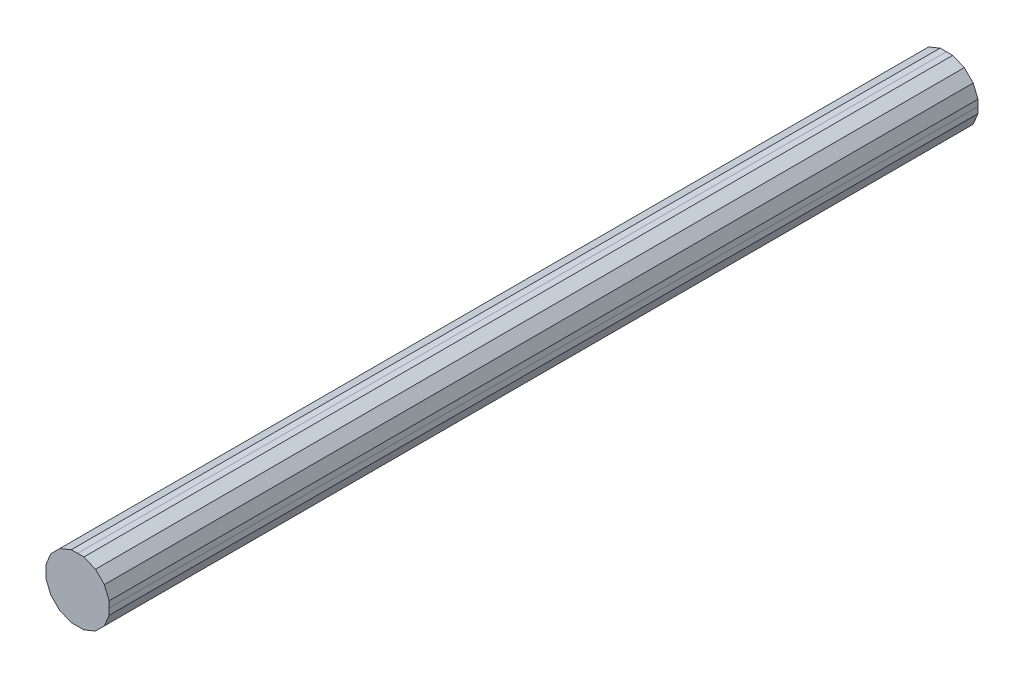
ISO-10303-21;
HEADER;
FILE_DESCRIPTION(('STEP AP214'),'2;1');
FILE_NAME('part.step','',(''),(''),'','','');
FILE_SCHEMA(('AUTOMOTIVE_DESIGN { 1 0 10303 214 1 1 1 1 }'));
ENDSEC;
DATA;
#1=APPLICATION_CONTEXT('core data for automotive mechanical design processes');
#2=APPLICATION_PROTOCOL_DEFINITION('international standard','automotive_design',2000,#1);
#3=PRODUCT_CONTEXT('',#1,'mechanical');
#4=PRODUCT('Part','Part','',(#3));
#5=PRODUCT_RELATED_PRODUCT_CATEGORY('part','',(#4));
#6=PRODUCT_DEFINITION_FORMATION('','',#4);
#7=PRODUCT_DEFINITION_CONTEXT('part definition',#1,'design');
#8=PRODUCT_DEFINITION('design','',#6,#7);
#9=PRODUCT_DEFINITION_SHAPE('','',#8);
#10=(LENGTH_UNIT() NAMED_UNIT(*) SI_UNIT(.MILLI.,.METRE.));
#11=(NAMED_UNIT(*) PLANE_ANGLE_UNIT() SI_UNIT($,.RADIAN.));
#12=(NAMED_UNIT(*) SI_UNIT($,.STERADIAN.) SOLID_ANGLE_UNIT());
#13=UNCERTAINTY_MEASURE_WITH_UNIT(LENGTH_MEASURE(1.E-05),#10,'distance_accuracy_value','');
#14=(GEOMETRIC_REPRESENTATION_CONTEXT(3) GLOBAL_UNCERTAINTY_ASSIGNED_CONTEXT((#13)) GLOBAL_UNIT_ASSIGNED_CONTEXT((#10,
#11,#12)) REPRESENTATION_CONTEXT('',''));
#15=CARTESIAN_POINT('',(0.,0.,0.));
#16=DIRECTION('',(0.,0.,1.));
#17=DIRECTION('',(1.,0.,0.));
#18=AXIS2_PLACEMENT_3D('',#15,#16,#17);
#19=CARTESIAN_POINT('',(-0.25449276,0.,7.00000124));
#20=DIRECTION('',(0.,0.,-1.));
#21=DIRECTION('',(0.,-1.,0.));
#22=AXIS2_PLACEMENT_3D('',#19,#20,#21);
#23=PLANE('',#22);
#24=DIRECTION('',(0.,-1.,0.));
#25=VECTOR('',#24,1.);
#26=CARTESIAN_POINT('',(-0.25449276,0.,7.00000124));
#27=LINE('',#26,#25);
#28=CARTESIAN_POINT('',(-0.25449276,0.,7.00000124));
#29=VERTEX_POINT('',#28);
#30=CARTESIAN_POINT('',(-0.25449276,-0.05061966,7.00000124));
#31=VERTEX_POINT('',#30);
#32=EDGE_CURVE('E290',#29,#31,#27,.T.);
#33=ORIENTED_EDGE('',*,*,#32,.T.);
#34=DIRECTION('',(0.382687101635991,-0.923878012640979,0.));
#35=VECTOR('',#34,1.);
#36=CARTESIAN_POINT('',(-0.25449276,-0.05061966,7.00000124));
#37=LINE('',#36,#35);
#38=CARTESIAN_POINT('',(-0.2157476,-0.1441577,7.00000124));
#39=VERTEX_POINT('',#38);
#40=EDGE_CURVE('E206',#31,#39,#37,.T.);
#41=ORIENTED_EDGE('',*,*,#40,.T.);
#42=DIRECTION('',(0.707106781186048,-0.707106781187048,0.));
#43=VECTOR('',#42,1.);
#44=CARTESIAN_POINT('',(-0.2157476,-0.1441577,7.00000124));
#45=LINE('',#44,#43);
#46=CARTESIAN_POINT('',(-0.1441577,-0.2157476,7.00000124));
#47=VERTEX_POINT('',#46);
#48=EDGE_CURVE('E204',#39,#47,#45,.T.);
#49=ORIENTED_EDGE('',*,*,#48,.T.);
#50=DIRECTION('',(0.923878012641332,-0.382687101635137,0.));
#51=VECTOR('',#50,1.);
#52=CARTESIAN_POINT('',(-0.1441577,-0.2157476,7.00000124));
#53=LINE('',#52,#51);
#54=CARTESIAN_POINT('',(-0.05061966,-0.25449276,7.00000124));
#55=VERTEX_POINT('',#54);
#56=EDGE_CURVE('E189',#47,#55,#53,.T.);
#57=ORIENTED_EDGE('',*,*,#56,.T.);
#58=DIRECTION('',(1.,0.,0.));
#59=VECTOR('',#58,1.);
#60=CARTESIAN_POINT('',(-0.05061966,-0.25449276,7.00000124));
#61=LINE('',#60,#59);
#62=CARTESIAN_POINT('',(0.,-0.25449276,7.00000124));
#63=VERTEX_POINT('',#62);
#64=EDGE_CURVE('E320',#55,#63,#61,.T.);
#65=ORIENTED_EDGE('',*,*,#64,.T.);
#66=DIRECTION('',(1.,0.,0.));
#67=VECTOR('',#66,1.);
#68=CARTESIAN_POINT('',(0.,-0.25449276,7.00000124));
#69=LINE('',#68,#67);
#70=CARTESIAN_POINT('',(0.05062220000002,-0.25449276,7.00000124));
#71=VERTEX_POINT('',#70);
#72=EDGE_CURVE('E306',#63,#71,#69,.T.);
#73=ORIENTED_EDGE('',*,*,#72,.T.);
#74=DIRECTION('',(0.923878012640979,0.382687101635991,0.));
#75=VECTOR('',#74,1.);
#76=CARTESIAN_POINT('',(0.05062220000002,-0.25449276,7.00000124));
#77=LINE('',#76,#75);
#78=CARTESIAN_POINT('',(0.14416024,-0.2157476,7.00000124));
#79=VERTEX_POINT('',#78);
#80=EDGE_CURVE('E228',#71,#79,#77,.T.);
#81=ORIENTED_EDGE('',*,*,#80,.T.);
#82=DIRECTION('',(0.707106781187048,0.707106781186048,0.));
#83=VECTOR('',#82,1.);
#84=CARTESIAN_POINT('',(0.14416024,-0.2157476,7.00000124));
#85=LINE('',#84,#83);
#86=CARTESIAN_POINT('',(0.21575014,-0.1441577,7.00000124));
#87=VERTEX_POINT('',#86);
#88=EDGE_CURVE('E358',#79,#87,#85,.T.);
#89=ORIENTED_EDGE('',*,*,#88,.T.);
#90=DIRECTION('',(0.382665687744127,0.923886882374306,0.));
#91=VECTOR('',#90,1.);
#92=CARTESIAN_POINT('',(0.21575014,-0.1441577,7.00000124));
#93=LINE('',#92,#91);
#94=CARTESIAN_POINT('',(0.25449276,-0.05061966,7.00000124));
#95=VERTEX_POINT('',#94);
#96=EDGE_CURVE('E331',#87,#95,#93,.T.);
#97=ORIENTED_EDGE('',*,*,#96,.T.);
#98=DIRECTION('',(0.,1.,0.));
#99=VECTOR('',#98,1.);
#100=CARTESIAN_POINT('',(0.25449276,-0.05061966,7.00000124));
#101=LINE('',#100,#99);
#102=CARTESIAN_POINT('',(0.25449276,-2.539999982787E-06,7.00000124));
#103=VERTEX_POINT('',#102);
#104=EDGE_CURVE('E250',#95,#103,#101,.T.);
#105=ORIENTED_EDGE('',*,*,#104,.T.);
#106=DIRECTION('',(0.,1.,0.));
#107=VECTOR('',#106,1.);
#108=CARTESIAN_POINT('',(0.25449276,-2.539999982787E-06,7.00000124));
#109=LINE('',#108,#107);
#110=CARTESIAN_POINT('',(0.25449276,0.05061966000001,7.00000124));
#111=VERTEX_POINT('',#110);
#112=EDGE_CURVE('E234',#103,#111,#109,.T.);
#113=ORIENTED_EDGE('',*,*,#112,.T.);
#114=DIRECTION('',(-0.382665687744127,0.923886882374306,0.));
#115=VECTOR('',#114,1.);
#116=CARTESIAN_POINT('',(0.25449276,0.05061966000001,7.00000124));
#117=LINE('',#116,#115);
#118=CARTESIAN_POINT('',(0.21575014,0.1441577,7.00000124));
#119=VERTEX_POINT('',#118);
#120=EDGE_CURVE('E271',#111,#119,#117,.T.);
#121=ORIENTED_EDGE('',*,*,#120,.T.);
#122=DIRECTION('',(-0.707106781187048,0.707106781186048,0.));
#123=VECTOR('',#122,1.);
#124=CARTESIAN_POINT('',(0.21575014,0.1441577,7.00000124));
#125=LINE('',#124,#123);
#126=CARTESIAN_POINT('',(0.14416024,0.2157476,7.00000124));
#127=VERTEX_POINT('',#126);
#128=EDGE_CURVE('E687',#119,#127,#125,.T.);
#129=ORIENTED_EDGE('',*,*,#128,.T.);
#130=DIRECTION('',(-0.923878012640979,0.382687101635991,0.));
#131=VECTOR('',#130,1.);
#132=CARTESIAN_POINT('',(0.14416024,0.2157476,7.00000124));
#133=LINE('',#132,#131);
#134=CARTESIAN_POINT('',(0.05062220000002,0.25449276,7.00000124));
#135=VERTEX_POINT('',#134);
#136=EDGE_CURVE('E370',#127,#135,#133,.T.);
#137=ORIENTED_EDGE('',*,*,#136,.T.);
#138=DIRECTION('',(-1.,0.,0.));
#139=VECTOR('',#138,1.);
#140=CARTESIAN_POINT('',(0.05062220000002,0.25449276,7.00000124));
#141=LINE('',#140,#139);
#142=CARTESIAN_POINT('',(0.,0.25449276,7.00000124));
#143=VERTEX_POINT('',#142);
#144=EDGE_CURVE('E291',#135,#143,#141,.T.);
#145=ORIENTED_EDGE('',*,*,#144,.T.);
#146=DIRECTION('',(-1.,0.,0.));
#147=VECTOR('',#146,1.);
#148=CARTESIAN_POINT('',(0.,0.25449276,7.00000124));
#149=LINE('',#148,#147);
#150=CARTESIAN_POINT('',(-0.05061966,0.25449276,7.00000124));
#151=VERTEX_POINT('',#150);
#152=EDGE_CURVE('E310',#143,#151,#149,.T.);
#153=ORIENTED_EDGE('',*,*,#152,.T.);
#154=DIRECTION('',(-0.923878012640979,-0.382687101635991,0.));
#155=VECTOR('',#154,1.);
#156=CARTESIAN_POINT('',(-0.05061966,0.25449276,7.00000124));
#157=LINE('',#156,#155);
#158=CARTESIAN_POINT('',(-0.1441577,0.2157476,7.00000124));
#159=VERTEX_POINT('',#158);
#160=EDGE_CURVE('E315',#151,#159,#157,.T.);
#161=ORIENTED_EDGE('',*,*,#160,.T.);
#162=DIRECTION('',(-0.707106781186548,-0.707106781186548,0.));
#163=VECTOR('',#162,1.);
#164=CARTESIAN_POINT('',(-0.1441577,0.2157476,7.00000124));
#165=LINE('',#164,#163);
#166=CARTESIAN_POINT('',(-0.2157476,0.1441577,7.00000124));
#167=VERTEX_POINT('',#166);
#168=EDGE_CURVE('E259',#159,#167,#165,.T.);
#169=ORIENTED_EDGE('',*,*,#168,.T.);
#170=DIRECTION('',(-0.382687101635991,-0.923878012640979,0.));
#171=VECTOR('',#170,1.);
#172=CARTESIAN_POINT('',(-0.2157476,0.1441577,7.00000124));
#173=LINE('',#172,#171);
#174=CARTESIAN_POINT('',(-0.25449276,0.05061966000001,7.00000124));
#175=VERTEX_POINT('',#174);
#176=EDGE_CURVE('E274',#167,#175,#173,.T.);
#177=ORIENTED_EDGE('',*,*,#176,.T.);
#178=DIRECTION('',(0.,-1.,0.));
#179=VECTOR('',#178,1.);
#180=CARTESIAN_POINT('',(-0.25449276,0.05061966000001,7.00000124));
#181=LINE('',#180,#179);
#182=EDGE_CURVE('E11',#175,#29,#181,.T.);
#183=ORIENTED_EDGE('',*,*,#182,.T.);
#184=EDGE_LOOP('',(#33,#41,#49,#57,#65,#73,#81,#89,#97,#105,#113,#121,#129,#137,#145,#153,#161,
#169,#177,#183));
#185=FACE_BOUND('',#184,.T.);
#186=ADVANCED_FACE('F17',(#185),#23,.F.);
#187=CARTESIAN_POINT('',(-0.25449276,0.,0.));
#188=DIRECTION('',(0.,0.,-1.));
#189=DIRECTION('',(0.,-1.,0.));
#190=AXIS2_PLACEMENT_3D('',#187,#188,#189);
#191=PLANE('',#190);
#192=DIRECTION('',(0.,-1.,0.));
#193=VECTOR('',#192,1.);
#194=CARTESIAN_POINT('',(-0.25449276,0.05061966000001,0.));
#195=LINE('',#194,#193);
#196=CARTESIAN_POINT('',(-0.25449276,0.05061966000001,0.));
#197=VERTEX_POINT('',#196);
#198=CARTESIAN_POINT('',(-0.25449276,0.,0.));
#199=VERTEX_POINT('',#198);
#200=EDGE_CURVE('E28',#197,#199,#195,.T.);
#201=ORIENTED_EDGE('',*,*,#200,.F.);
#202=DIRECTION('',(-0.382687101635991,-0.923878012640979,0.));
#203=VECTOR('',#202,1.);
#204=CARTESIAN_POINT('',(-0.2157476,0.1441577,0.));
#205=LINE('',#204,#203);
#206=CARTESIAN_POINT('',(-0.2157476,0.1441577,0.));
#207=VERTEX_POINT('',#206);
#208=EDGE_CURVE('E254',#207,#197,#205,.T.);
#209=ORIENTED_EDGE('',*,*,#208,.F.);
#210=DIRECTION('',(-0.707106781186548,-0.707106781186548,0.));
#211=VECTOR('',#210,1.);
#212=CARTESIAN_POINT('',(-0.1441577,0.2157476,0.));
#213=LINE('',#212,#211);
#214=CARTESIAN_POINT('',(-0.1441577,0.2157476,0.));
#215=VERTEX_POINT('',#214);
#216=EDGE_CURVE('E268',#215,#207,#213,.T.);
#217=ORIENTED_EDGE('',*,*,#216,.F.);
#218=DIRECTION('',(-0.923878012640979,-0.382687101635991,0.));
#219=VECTOR('',#218,1.);
#220=CARTESIAN_POINT('',(-0.05061966,0.25449276,0.));
#221=LINE('',#220,#219);
#222=CARTESIAN_POINT('',(-0.05061966,0.25449276,0.));
#223=VERTEX_POINT('',#222);
#224=EDGE_CURVE('E316',#223,#215,#221,.T.);
#225=ORIENTED_EDGE('',*,*,#224,.F.);
#226=DIRECTION('',(-1.,0.,0.));
#227=VECTOR('',#226,1.);
#228=CARTESIAN_POINT('',(0.,0.25449276,0.));
#229=LINE('',#228,#227);
#230=CARTESIAN_POINT('',(0.,0.25449276,0.));
#231=VERTEX_POINT('',#230);
#232=EDGE_CURVE('E295',#231,#223,#229,.T.);
#233=ORIENTED_EDGE('',*,*,#232,.F.);
#234=DIRECTION('',(-1.,0.,0.));
#235=VECTOR('',#234,1.);
#236=CARTESIAN_POINT('',(0.05062220000002,0.25449276,0.));
#237=LINE('',#236,#235);
#238=CARTESIAN_POINT('',(0.05062220000002,0.25449276,0.));
#239=VERTEX_POINT('',#238);
#240=EDGE_CURVE('E374',#239,#231,#237,.T.);
#241=ORIENTED_EDGE('',*,*,#240,.F.);
#242=DIRECTION('',(-0.923878012640979,0.382687101635991,0.));
#243=VECTOR('',#242,1.);
#244=CARTESIAN_POINT('',(0.14416024,0.2157476,0.));
#245=LINE('',#244,#243);
#246=CARTESIAN_POINT('',(0.14416024,0.2157476,0.));
#247=VERTEX_POINT('',#246);
#248=EDGE_CURVE('E682',#247,#239,#245,.T.);
#249=ORIENTED_EDGE('',*,*,#248,.F.);
#250=DIRECTION('',(-0.707106781187048,0.707106781186048,0.));
#251=VECTOR('',#250,1.);
#252=CARTESIAN_POINT('',(0.21575014,0.1441577,0.));
#253=LINE('',#252,#251);
#254=CARTESIAN_POINT('',(0.21575014,0.1441577,0.));
#255=VERTEX_POINT('',#254);
#256=EDGE_CURVE('E365',#255,#247,#253,.T.);
#257=ORIENTED_EDGE('',*,*,#256,.F.);
#258=DIRECTION('',(-0.382665687744127,0.923886882374306,0.));
#259=VECTOR('',#258,1.);
#260=CARTESIAN_POINT('',(0.25449276,0.05061966000001,0.));
#261=LINE('',#260,#259);
#262=CARTESIAN_POINT('',(0.25449276,0.05061966000001,0.));
#263=VERTEX_POINT('',#262);
#264=EDGE_CURVE('E229',#263,#255,#261,.T.);
#265=ORIENTED_EDGE('',*,*,#264,.F.);
#266=DIRECTION('',(0.,1.,0.));
#267=VECTOR('',#266,1.);
#268=CARTESIAN_POINT('',(0.25449276,-2.539999982787E-06,0.));
#269=LINE('',#268,#267);
#270=CARTESIAN_POINT('',(0.25449276,-2.539999982787E-06,0.));
#271=VERTEX_POINT('',#270);
#272=EDGE_CURVE('E222',#271,#263,#269,.T.);
#273=ORIENTED_EDGE('',*,*,#272,.F.);
#274=DIRECTION('',(0.,1.,0.));
#275=VECTOR('',#274,1.);
#276=CARTESIAN_POINT('',(0.25449276,-0.05061966,0.));
#277=LINE('',#276,#275);
#278=CARTESIAN_POINT('',(0.25449276,-0.05061966,0.));
#279=VERTEX_POINT('',#278);
#280=EDGE_CURVE('E263',#279,#271,#277,.T.);
#281=ORIENTED_EDGE('',*,*,#280,.F.);
#282=DIRECTION('',(0.382665687744127,0.923886882374306,0.));
#283=VECTOR('',#282,1.);
#284=CARTESIAN_POINT('',(0.21575014,-0.1441577,0.));
#285=LINE('',#284,#283);
#286=CARTESIAN_POINT('',(0.21575014,-0.1441577,0.));
#287=VERTEX_POINT('',#286);
#288=EDGE_CURVE('E342',#287,#279,#285,.T.);
#289=ORIENTED_EDGE('',*,*,#288,.F.);
#290=DIRECTION('',(0.707106781187048,0.707106781186048,0.));
#291=VECTOR('',#290,1.);
#292=CARTESIAN_POINT('',(0.14416024,-0.2157476,0.));
#293=LINE('',#292,#291);
#294=CARTESIAN_POINT('',(0.14416024,-0.2157476,0.));
#295=VERTEX_POINT('',#294);
#296=EDGE_CURVE('E224',#295,#287,#293,.T.);
#297=ORIENTED_EDGE('',*,*,#296,.F.);
#298=DIRECTION('',(0.923878012640979,0.382687101635991,0.));
#299=VECTOR('',#298,1.);
#300=CARTESIAN_POINT('',(0.05062220000002,-0.25449276,0.));
#301=LINE('',#300,#299);
#302=CARTESIAN_POINT('',(0.05062220000002,-0.25449276,0.));
#303=VERTEX_POINT('',#302);
#304=EDGE_CURVE('E301',#303,#295,#301,.T.);
#305=ORIENTED_EDGE('',*,*,#304,.F.);
#306=DIRECTION('',(1.,0.,0.));
#307=VECTOR('',#306,1.);
#308=CARTESIAN_POINT('',(0.,-0.25449276,0.));
#309=LINE('',#308,#307);
#310=CARTESIAN_POINT('',(0.,-0.25449276,0.));
#311=VERTEX_POINT('',#310);
#312=EDGE_CURVE('E323',#311,#303,#309,.T.);
#313=ORIENTED_EDGE('',*,*,#312,.F.);
#314=DIRECTION('',(1.,0.,0.));
#315=VECTOR('',#314,1.);
#316=CARTESIAN_POINT('',(-0.05061966,-0.25449276,0.));
#317=LINE('',#316,#315);
#318=CARTESIAN_POINT('',(-0.05061966,-0.25449276,0.));
#319=VERTEX_POINT('',#318);
#320=EDGE_CURVE('E201',#319,#311,#317,.T.);
#321=ORIENTED_EDGE('',*,*,#320,.F.);
#322=DIRECTION('',(0.923878012641332,-0.382687101635137,0.));
#323=VECTOR('',#322,1.);
#324=CARTESIAN_POINT('',(-0.1441577,-0.2157476,0.));
#325=LINE('',#324,#323);
#326=CARTESIAN_POINT('',(-0.1441577,-0.2157476,0.));
#327=VERTEX_POINT('',#326);
#328=EDGE_CURVE('E211',#327,#319,#325,.T.);
#329=ORIENTED_EDGE('',*,*,#328,.F.);
#330=DIRECTION('',(0.707106781186048,-0.707106781187048,0.));
#331=VECTOR('',#330,1.);
#332=CARTESIAN_POINT('',(-0.2157476,-0.1441577,0.));
#333=LINE('',#332,#331);
#334=CARTESIAN_POINT('',(-0.2157476,-0.1441577,0.));
#335=VERTEX_POINT('',#334);
#336=EDGE_CURVE('E21',#335,#327,#333,.T.);
#337=ORIENTED_EDGE('',*,*,#336,.F.);
#338=DIRECTION('',(0.382687101635991,-0.923878012640979,0.));
#339=VECTOR('',#338,1.);
#340=CARTESIAN_POINT('',(-0.25449276,-0.05061966,0.));
#341=LINE('',#340,#339);
#342=CARTESIAN_POINT('',(-0.25449276,-0.05061966,0.));
#343=VERTEX_POINT('',#342);
#344=EDGE_CURVE('E235',#343,#335,#341,.T.);
#345=ORIENTED_EDGE('',*,*,#344,.F.);
#346=DIRECTION('',(0.,-1.,0.));
#347=VECTOR('',#346,1.);
#348=CARTESIAN_POINT('',(-0.25449276,0.,0.));
#349=LINE('',#348,#347);
#350=EDGE_CURVE('E350',#199,#343,#349,.T.);
#351=ORIENTED_EDGE('',*,*,#350,.F.);
#352=EDGE_LOOP('',(#201,#209,#217,#225,#233,#241,#249,#257,#265,#273,#281,#289,#297,#305,#313,
#321,#329,#337,#345,#351));
#353=FACE_BOUND('',#352,.T.);
#354=ADVANCED_FACE('F387',(#353),#191,.T.);
#355=CARTESIAN_POINT('',(-0.25449276,0.05061966000001,0.));
#356=DIRECTION('',(1.,0.,0.));
#357=DIRECTION('',(0.,1.,0.));
#358=AXIS2_PLACEMENT_3D('',#355,#356,#357);
#359=PLANE('',#358);
#360=ORIENTED_EDGE('',*,*,#200,.T.);
#361=DIRECTION('',(0.,0.,1.));
#362=VECTOR('',#361,1.);
#363=CARTESIAN_POINT('',(-0.25449276,0.,0.));
#364=LINE('',#363,#362);
#365=EDGE_CURVE('E240',#199,#29,#364,.T.);
#366=ORIENTED_EDGE('',*,*,#365,.T.);
#367=ORIENTED_EDGE('',*,*,#182,.F.);
#368=DIRECTION('',(0.,0.,1.));
#369=VECTOR('',#368,1.);
#370=CARTESIAN_POINT('',(-0.25449276,0.05061966000001,0.));
#371=LINE('',#370,#369);
#372=EDGE_CURVE('E258',#197,#175,#371,.T.);
#373=ORIENTED_EDGE('',*,*,#372,.F.);
#374=EDGE_LOOP('',(#360,#366,#367,#373));
#375=FACE_BOUND('',#374,.T.);
#376=ADVANCED_FACE('F19',(#375),#359,.F.);
#377=CARTESIAN_POINT('',(-0.2157476,0.1441577,0.));
#378=DIRECTION('',(0.923878012640979,-0.382687101635991,0.));
#379=DIRECTION('',(0.,0.,-1.));
#380=AXIS2_PLACEMENT_3D('',#377,#378,#379);
#381=PLANE('',#380);
#382=ORIENTED_EDGE('',*,*,#208,.T.);
#383=ORIENTED_EDGE('',*,*,#372,.T.);
#384=ORIENTED_EDGE('',*,*,#176,.F.);
#385=DIRECTION('',(0.,0.,1.));
#386=VECTOR('',#385,1.);
#387=CARTESIAN_POINT('',(-0.2157476,0.1441577,0.));
#388=LINE('',#387,#386);
#389=EDGE_CURVE('E264',#207,#167,#388,.T.);
#390=ORIENTED_EDGE('',*,*,#389,.F.);
#391=EDGE_LOOP('',(#382,#383,#384,#390));
#392=FACE_BOUND('',#391,.T.);
#393=ADVANCED_FACE('F385',(#392),#381,.F.);
#394=CARTESIAN_POINT('',(-0.1441577,0.2157476,0.));
#395=DIRECTION('',(0.707106781186548,-0.707106781186548,0.));
#396=DIRECTION('',(0.,0.,-1.));
#397=AXIS2_PLACEMENT_3D('',#394,#395,#396);
#398=PLANE('',#397);
#399=ORIENTED_EDGE('',*,*,#216,.T.);
#400=ORIENTED_EDGE('',*,*,#389,.T.);
#401=ORIENTED_EDGE('',*,*,#168,.F.);
#402=DIRECTION('',(0.,0.,1.));
#403=VECTOR('',#402,1.);
#404=CARTESIAN_POINT('',(-0.1441577,0.2157476,0.));
#405=LINE('',#404,#403);
#406=EDGE_CURVE('E311',#215,#159,#405,.T.);
#407=ORIENTED_EDGE('',*,*,#406,.F.);
#408=EDGE_LOOP('',(#399,#400,#401,#407));
#409=FACE_BOUND('',#408,.T.);
#410=ADVANCED_FACE('F384',(#409),#398,.F.);
#411=CARTESIAN_POINT('',(-0.05061966,0.25449276,0.));
#412=DIRECTION('',(0.382687101635991,-0.923878012640979,0.));
#413=DIRECTION('',(0.,0.,-1.));
#414=AXIS2_PLACEMENT_3D('',#411,#412,#413);
#415=PLANE('',#414);
#416=ORIENTED_EDGE('',*,*,#224,.T.);
#417=ORIENTED_EDGE('',*,*,#406,.T.);
#418=ORIENTED_EDGE('',*,*,#160,.F.);
#419=DIRECTION('',(0.,0.,1.));
#420=VECTOR('',#419,1.);
#421=CARTESIAN_POINT('',(-0.05061966,0.25449276,0.));
#422=LINE('',#421,#420);
#423=EDGE_CURVE('E300',#223,#151,#422,.T.);
#424=ORIENTED_EDGE('',*,*,#423,.F.);
#425=EDGE_LOOP('',(#416,#417,#418,#424));
#426=FACE_BOUND('',#425,.T.);
#427=ADVANCED_FACE('F410',(#426),#415,.F.);
#428=CARTESIAN_POINT('',(0.,0.25449276,0.));
#429=DIRECTION('',(0.,-1.,0.));
#430=DIRECTION('',(0.,0.,-1.));
#431=AXIS2_PLACEMENT_3D('',#428,#429,#430);
#432=PLANE('',#431);
#433=ORIENTED_EDGE('',*,*,#232,.T.);
#434=ORIENTED_EDGE('',*,*,#423,.T.);
#435=ORIENTED_EDGE('',*,*,#152,.F.);
#436=DIRECTION('',(0.,0.,1.));
#437=VECTOR('',#436,1.);
#438=CARTESIAN_POINT('',(0.,0.25449276,0.));
#439=LINE('',#438,#437);
#440=EDGE_CURVE('E296',#231,#143,#439,.T.);
#441=ORIENTED_EDGE('',*,*,#440,.F.);
#442=EDGE_LOOP('',(#433,#434,#435,#441));
#443=FACE_BOUND('',#442,.T.);
#444=ADVANCED_FACE('F406',(#443),#432,.F.);
#445=CARTESIAN_POINT('',(0.05062220000002,0.25449276,0.));
#446=DIRECTION('',(0.,-1.,0.));
#447=DIRECTION('',(0.,0.,-1.));
#448=AXIS2_PLACEMENT_3D('',#445,#446,#447);
#449=PLANE('',#448);
#450=ORIENTED_EDGE('',*,*,#240,.T.);
#451=ORIENTED_EDGE('',*,*,#440,.T.);
#452=ORIENTED_EDGE('',*,*,#144,.F.);
#453=DIRECTION('',(0.,0.,1.));
#454=VECTOR('',#453,1.);
#455=CARTESIAN_POINT('',(0.05062220000002,0.25449276,0.));
#456=LINE('',#455,#454);
#457=EDGE_CURVE('E375',#239,#135,#456,.T.);
#458=ORIENTED_EDGE('',*,*,#457,.F.);
#459=EDGE_LOOP('',(#450,#451,#452,#458));
#460=FACE_BOUND('',#459,.T.);
#461=ADVANCED_FACE('F409',(#460),#449,.F.);
#462=CARTESIAN_POINT('',(0.14416024,0.2157476,0.));
#463=DIRECTION('',(-0.382687101635991,-0.923878012640979,0.));
#464=DIRECTION('',(-0.923878012640979,0.382687101635991,0.));
#465=AXIS2_PLACEMENT_3D('',#462,#463,#464);
#466=PLANE('',#465);
#467=ORIENTED_EDGE('',*,*,#248,.T.);
#468=ORIENTED_EDGE('',*,*,#457,.T.);
#469=ORIENTED_EDGE('',*,*,#136,.F.);
#470=DIRECTION('',(0.,0.,1.));
#471=VECTOR('',#470,1.);
#472=CARTESIAN_POINT('',(0.14416024,0.2157476,0.));
#473=LINE('',#472,#471);
#474=EDGE_CURVE('E369',#247,#127,#473,.T.);
#475=ORIENTED_EDGE('',*,*,#474,.F.);
#476=EDGE_LOOP('',(#467,#468,#469,#475));
#477=FACE_BOUND('',#476,.T.);
#478=ADVANCED_FACE('F426',(#477),#466,.F.);
#479=CARTESIAN_POINT('',(0.21575014,0.1441577,0.));
#480=DIRECTION('',(-0.707106781186048,-0.707106781187048,0.));
#481=DIRECTION('',(-0.707106781187048,0.707106781186048,0.));
#482=AXIS2_PLACEMENT_3D('',#479,#480,#481);
#483=PLANE('',#482);
#484=ORIENTED_EDGE('',*,*,#256,.T.);
#485=ORIENTED_EDGE('',*,*,#474,.T.);
#486=ORIENTED_EDGE('',*,*,#128,.F.);
#487=DIRECTION('',(0.,0.,1.));
#488=VECTOR('',#487,1.);
#489=CARTESIAN_POINT('',(0.21575014,0.1441577,0.));
#490=LINE('',#489,#488);
#491=EDGE_CURVE('E233',#255,#119,#490,.T.);
#492=ORIENTED_EDGE('',*,*,#491,.F.);
#493=EDGE_LOOP('',(#484,#485,#486,#492));
#494=FACE_BOUND('',#493,.T.);
#495=ADVANCED_FACE('F422',(#494),#483,.F.);
#496=CARTESIAN_POINT('',(0.25449276,0.05061966000001,0.));
#497=DIRECTION('',(-0.923886882374306,-0.382665687744127,0.));
#498=DIRECTION('',(-0.382665687744127,0.923886882374306,0.));
#499=AXIS2_PLACEMENT_3D('',#496,#497,#498);
#500=PLANE('',#499);
#501=ORIENTED_EDGE('',*,*,#264,.T.);
#502=ORIENTED_EDGE('',*,*,#491,.T.);
#503=ORIENTED_EDGE('',*,*,#120,.F.);
#504=DIRECTION('',(0.,0.,1.));
#505=VECTOR('',#504,1.);
#506=CARTESIAN_POINT('',(0.25449276,0.05061966000001,0.));
#507=LINE('',#506,#505);
#508=EDGE_CURVE('E285',#263,#111,#507,.T.);
#509=ORIENTED_EDGE('',*,*,#508,.F.);
#510=EDGE_LOOP('',(#501,#502,#503,#509));
#511=FACE_BOUND('',#510,.T.);
#512=ADVANCED_FACE('F425',(#511),#500,.F.);
#513=CARTESIAN_POINT('',(0.25449276,-2.539999982787E-06,0.));
#514=DIRECTION('',(-1.,0.,0.));
#515=DIRECTION('',(0.,0.,1.));
#516=AXIS2_PLACEMENT_3D('',#513,#514,#515);
#517=PLANE('',#516);
#518=ORIENTED_EDGE('',*,*,#272,.T.);
#519=ORIENTED_EDGE('',*,*,#508,.T.);
#520=ORIENTED_EDGE('',*,*,#112,.F.);
#521=DIRECTION('',(0.,0.,1.));
#522=VECTOR('',#521,1.);
#523=CARTESIAN_POINT('',(0.25449276,-2.539999982787E-06,0.));
#524=LINE('',#523,#522);
#525=EDGE_CURVE('E253',#271,#103,#524,.T.);
#526=ORIENTED_EDGE('',*,*,#525,.F.);
#527=EDGE_LOOP('',(#518,#519,#520,#526));
#528=FACE_BOUND('',#527,.T.);
#529=ADVANCED_FACE('F442',(#528),#517,.F.);
#530=CARTESIAN_POINT('',(0.25449276,-0.05061966,0.));
#531=DIRECTION('',(-1.,0.,0.));
#532=DIRECTION('',(0.,0.,1.));
#533=AXIS2_PLACEMENT_3D('',#530,#531,#532);
#534=PLANE('',#533);
#535=ORIENTED_EDGE('',*,*,#280,.T.);
#536=ORIENTED_EDGE('',*,*,#525,.T.);
#537=ORIENTED_EDGE('',*,*,#104,.F.);
#538=DIRECTION('',(0.,0.,1.));
#539=VECTOR('',#538,1.);
#540=CARTESIAN_POINT('',(0.25449276,-0.05061966,0.));
#541=LINE('',#540,#539);
#542=EDGE_CURVE('E338',#279,#95,#541,.T.);
#543=ORIENTED_EDGE('',*,*,#542,.F.);
#544=EDGE_LOOP('',(#535,#536,#537,#543));
#545=FACE_BOUND('',#544,.T.);
#546=ADVANCED_FACE('F420',(#545),#534,.F.);
#547=CARTESIAN_POINT('',(0.21575014,-0.1441577,0.));
#548=DIRECTION('',(-0.923886882374306,0.382665687744127,0.));
#549=DIRECTION('',(0.,0.,1.));
#550=AXIS2_PLACEMENT_3D('',#547,#548,#549);
#551=PLANE('',#550);
#552=ORIENTED_EDGE('',*,*,#288,.T.);
#553=ORIENTED_EDGE('',*,*,#542,.T.);
#554=ORIENTED_EDGE('',*,*,#96,.F.);
#555=DIRECTION('',(0.,0.,1.));
#556=VECTOR('',#555,1.);
#557=CARTESIAN_POINT('',(0.21575014,-0.1441577,0.));
#558=LINE('',#557,#556);
#559=EDGE_CURVE('E227',#287,#87,#558,.T.);
#560=ORIENTED_EDGE('',*,*,#559,.F.);
#561=EDGE_LOOP('',(#552,#553,#554,#560));
#562=FACE_BOUND('',#561,.T.);
#563=ADVANCED_FACE('F417',(#562),#551,.F.);
#564=CARTESIAN_POINT('',(0.14416024,-0.2157476,0.));
#565=DIRECTION('',(-0.707106781186048,0.707106781187048,0.));
#566=DIRECTION('',(0.,0.,1.));
#567=AXIS2_PLACEMENT_3D('',#564,#565,#566);
#568=PLANE('',#567);
#569=ORIENTED_EDGE('',*,*,#296,.T.);
#570=ORIENTED_EDGE('',*,*,#559,.T.);
#571=ORIENTED_EDGE('',*,*,#88,.F.);
#572=DIRECTION('',(0.,0.,1.));
#573=VECTOR('',#572,1.);
#574=CARTESIAN_POINT('',(0.14416024,-0.2157476,0.));
#575=LINE('',#574,#573);
#576=EDGE_CURVE('E305',#295,#79,#575,.T.);
#577=ORIENTED_EDGE('',*,*,#576,.F.);
#578=EDGE_LOOP('',(#569,#570,#571,#577));
#579=FACE_BOUND('',#578,.T.);
#580=ADVANCED_FACE('F405',(#579),#568,.F.);
#581=CARTESIAN_POINT('',(0.05062220000002,-0.25449276,0.));
#582=DIRECTION('',(-0.382687101635991,0.923878012640979,0.));
#583=DIRECTION('',(0.,0.,1.));
#584=AXIS2_PLACEMENT_3D('',#581,#582,#583);
#585=PLANE('',#584);
#586=ORIENTED_EDGE('',*,*,#304,.T.);
#587=ORIENTED_EDGE('',*,*,#576,.T.);
#588=ORIENTED_EDGE('',*,*,#80,.F.);
#589=DIRECTION('',(0.,0.,1.));
#590=VECTOR('',#589,1.);
#591=CARTESIAN_POINT('',(0.05062220000002,-0.25449276,0.));
#592=LINE('',#591,#590);
#593=EDGE_CURVE('E354',#303,#71,#592,.T.);
#594=ORIENTED_EDGE('',*,*,#593,.F.);
#595=EDGE_LOOP('',(#586,#587,#588,#594));
#596=FACE_BOUND('',#595,.T.);
#597=ADVANCED_FACE('F452',(#596),#585,.F.);
#598=CARTESIAN_POINT('',(0.,-0.25449276,0.));
#599=DIRECTION('',(0.,1.,0.));
#600=DIRECTION('',(1.,0.,0.));
#601=AXIS2_PLACEMENT_3D('',#598,#599,#600);
#602=PLANE('',#601);
#603=ORIENTED_EDGE('',*,*,#312,.T.);
#604=ORIENTED_EDGE('',*,*,#593,.T.);
#605=ORIENTED_EDGE('',*,*,#72,.F.);
#606=DIRECTION('',(0.,0.,1.));
#607=VECTOR('',#606,1.);
#608=CARTESIAN_POINT('',(0.,-0.25449276,0.));
#609=LINE('',#608,#607);
#610=EDGE_CURVE('E324',#311,#63,#609,.T.);
#611=ORIENTED_EDGE('',*,*,#610,.F.);
#612=EDGE_LOOP('',(#603,#604,#605,#611));
#613=FACE_BOUND('',#612,.T.);
#614=ADVANCED_FACE('F415',(#613),#602,.F.);
#615=CARTESIAN_POINT('',(-0.05061966,-0.25449276,0.));
#616=DIRECTION('',(0.,1.,0.));
#617=DIRECTION('',(1.,0.,0.));
#618=AXIS2_PLACEMENT_3D('',#615,#616,#617);
#619=PLANE('',#618);
#620=ORIENTED_EDGE('',*,*,#320,.T.);
#621=ORIENTED_EDGE('',*,*,#610,.T.);
#622=ORIENTED_EDGE('',*,*,#64,.F.);
#623=DIRECTION('',(0.,0.,1.));
#624=VECTOR('',#623,1.);
#625=CARTESIAN_POINT('',(-0.05061966,-0.25449276,0.));
#626=LINE('',#625,#624);
#627=EDGE_CURVE('E197',#319,#55,#626,.T.);
#628=ORIENTED_EDGE('',*,*,#627,.F.);
#629=EDGE_LOOP('',(#620,#621,#622,#628));
#630=FACE_BOUND('',#629,.T.);
#631=ADVANCED_FACE('F412',(#630),#619,.F.);
#632=CARTESIAN_POINT('',(-0.1441577,-0.2157476,0.));
#633=DIRECTION('',(0.382687101635137,0.923878012641332,0.));
#634=DIRECTION('',(0.,0.,-1.));
#635=AXIS2_PLACEMENT_3D('',#632,#633,#634);
#636=PLANE('',#635);
#637=ORIENTED_EDGE('',*,*,#328,.T.);
#638=ORIENTED_EDGE('',*,*,#627,.T.);
#639=ORIENTED_EDGE('',*,*,#56,.F.);
#640=DIRECTION('',(0.,0.,1.));
#641=VECTOR('',#640,1.);
#642=CARTESIAN_POINT('',(-0.1441577,-0.2157476,0.));
#643=LINE('',#642,#641);
#644=EDGE_CURVE('E194',#327,#47,#643,.T.);
#645=ORIENTED_EDGE('',*,*,#644,.F.);
#646=EDGE_LOOP('',(#637,#638,#639,#645));
#647=FACE_BOUND('',#646,.T.);
#648=ADVANCED_FACE('F192',(#647),#636,.F.);
#649=CARTESIAN_POINT('',(-0.2157476,-0.1441577,0.));
#650=DIRECTION('',(0.707106781187048,0.707106781186048,0.));
#651=DIRECTION('',(0.,0.,-1.));
#652=AXIS2_PLACEMENT_3D('',#649,#650,#651);
#653=PLANE('',#652);
#654=ORIENTED_EDGE('',*,*,#336,.T.);
#655=ORIENTED_EDGE('',*,*,#644,.T.);
#656=ORIENTED_EDGE('',*,*,#48,.F.);
#657=DIRECTION('',(0.,0.,1.));
#658=VECTOR('',#657,1.);
#659=CARTESIAN_POINT('',(-0.2157476,-0.1441577,0.));
#660=LINE('',#659,#658);
#661=EDGE_CURVE('E239',#335,#39,#660,.T.);
#662=ORIENTED_EDGE('',*,*,#661,.F.);
#663=EDGE_LOOP('',(#654,#655,#656,#662));
#664=FACE_BOUND('',#663,.T.);
#665=ADVANCED_FACE('F213',(#664),#653,.F.);
#666=CARTESIAN_POINT('',(-0.25449276,-0.05061966,0.));
#667=DIRECTION('',(0.923878012640979,0.382687101635991,0.));
#668=DIRECTION('',(0.,0.,-1.));
#669=AXIS2_PLACEMENT_3D('',#666,#667,#668);
#670=PLANE('',#669);
#671=ORIENTED_EDGE('',*,*,#344,.T.);
#672=ORIENTED_EDGE('',*,*,#661,.T.);
#673=ORIENTED_EDGE('',*,*,#40,.F.);
#674=DIRECTION('',(0.,0.,1.));
#675=VECTOR('',#674,1.);
#676=CARTESIAN_POINT('',(-0.25449276,-0.05061966,0.));
#677=LINE('',#676,#675);
#678=EDGE_CURVE('E346',#343,#31,#677,.T.);
#679=ORIENTED_EDGE('',*,*,#678,.F.);
#680=EDGE_LOOP('',(#671,#672,#673,#679));
#681=FACE_BOUND('',#680,.T.);
#682=ADVANCED_FACE('F428',(#681),#670,.F.);
#683=CARTESIAN_POINT('',(-0.25449276,0.,0.));
#684=DIRECTION('',(1.,0.,0.));
#685=DIRECTION('',(0.,1.,0.));
#686=AXIS2_PLACEMENT_3D('',#683,#684,#685);
#687=PLANE('',#686);
#688=ORIENTED_EDGE('',*,*,#350,.T.);
#689=ORIENTED_EDGE('',*,*,#678,.T.);
#690=ORIENTED_EDGE('',*,*,#32,.F.);
#691=ORIENTED_EDGE('',*,*,#365,.F.);
#692=EDGE_LOOP('',(#688,#689,#690,#691));
#693=FACE_BOUND('',#692,.T.);
#694=ADVANCED_FACE('F431',(#693),#687,.F.);
#695=CLOSED_SHELL('',(#186,#354,#376,#393,#410,#427,#444,#461,#478,#495,#512,#529,#546,#563,
#580,#597,#614,#631,#648,#665,#682,#694));
#696=MANIFOLD_SOLID_BREP('B1',#695);
#697=ADVANCED_BREP_SHAPE_REPRESENTATION('',(#18,#696),#14);
#698=SHAPE_DEFINITION_REPRESENTATION(#9,#697);
ENDSEC;
END-ISO-10303-21;
